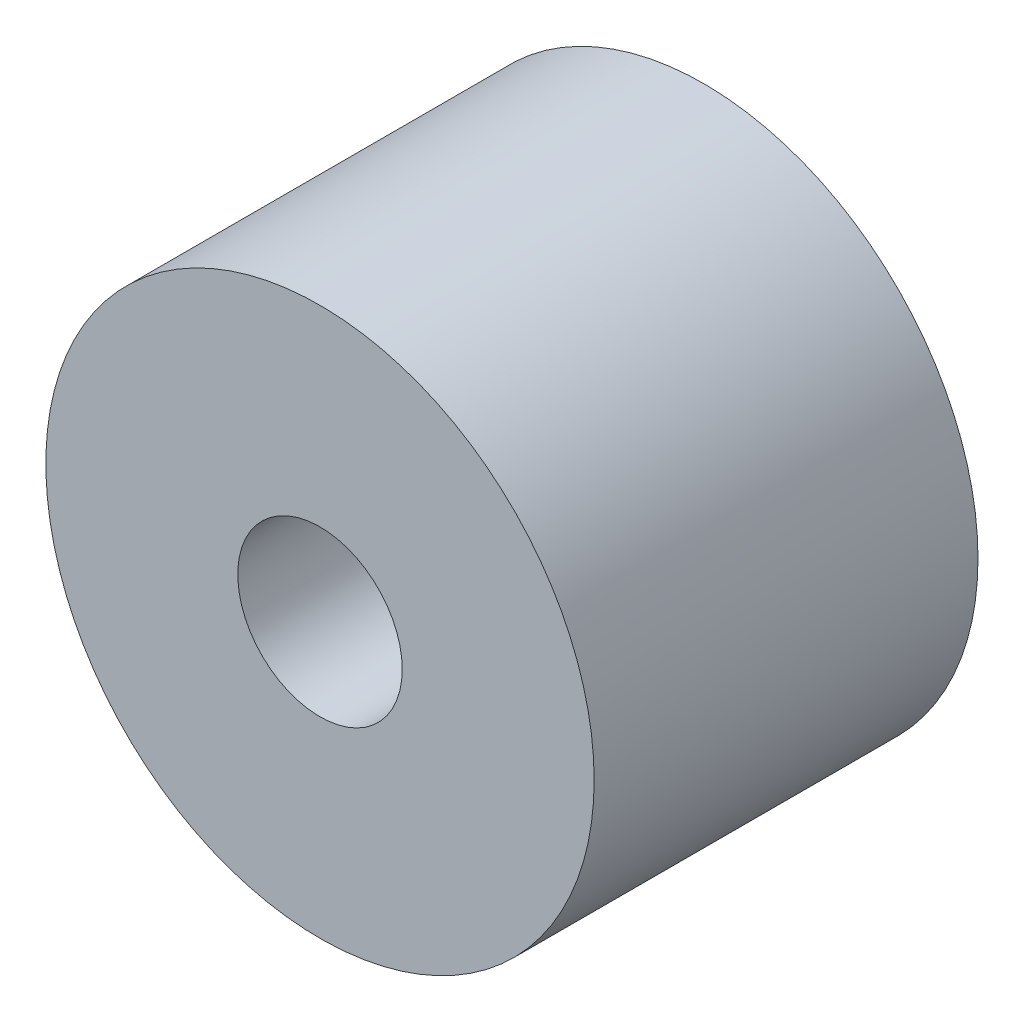
ISO-10303-21;
HEADER;
FILE_DESCRIPTION(('STEP AP214'),'2;1');
FILE_NAME('part.step','',(''),(''),'','','');
FILE_SCHEMA(('AUTOMOTIVE_DESIGN { 1 0 10303 214 1 1 1 1 }'));
ENDSEC;
DATA;
#1=APPLICATION_CONTEXT('core data for automotive mechanical design processes');
#2=APPLICATION_PROTOCOL_DEFINITION('international standard','automotive_design',2000,#1);
#3=PRODUCT_CONTEXT('',#1,'mechanical');
#4=PRODUCT('Part','Part','',(#3));
#5=PRODUCT_RELATED_PRODUCT_CATEGORY('part','',(#4));
#6=PRODUCT_DEFINITION_FORMATION('','',#4);
#7=PRODUCT_DEFINITION_CONTEXT('part definition',#1,'design');
#8=PRODUCT_DEFINITION('design','',#6,#7);
#9=PRODUCT_DEFINITION_SHAPE('','',#8);
#10=(LENGTH_UNIT() NAMED_UNIT(*) SI_UNIT(.MILLI.,.METRE.));
#11=(NAMED_UNIT(*) PLANE_ANGLE_UNIT() SI_UNIT($,.RADIAN.));
#12=(NAMED_UNIT(*) SI_UNIT($,.STERADIAN.) SOLID_ANGLE_UNIT());
#13=UNCERTAINTY_MEASURE_WITH_UNIT(LENGTH_MEASURE(1.E-05),#10,'distance_accuracy_value','');
#14=(GEOMETRIC_REPRESENTATION_CONTEXT(3) GLOBAL_UNCERTAINTY_ASSIGNED_CONTEXT((#13)) GLOBAL_UNIT_ASSIGNED_CONTEXT((#10,
#11,#12)) REPRESENTATION_CONTEXT('',''));
#15=CARTESIAN_POINT('',(0.,0.,0.));
#16=DIRECTION('',(0.,0.,1.));
#17=DIRECTION('',(1.,0.,0.));
#18=AXIS2_PLACEMENT_3D('',#15,#16,#17);
#19=CARTESIAN_POINT('',(0.,0.,3.5));
#20=DIRECTION('',(0.,0.,1.));
#21=DIRECTION('',(1.,0.,0.));
#22=AXIS2_PLACEMENT_3D('',#19,#20,#21);
#23=PLANE('',#22);
#24=CARTESIAN_POINT('',(0.,0.,3.5));
#25=DIRECTION('',(0.,0.,1.));
#26=DIRECTION('',(1.,0.,0.));
#27=AXIS2_PLACEMENT_3D('',#24,#25,#26);
#28=CIRCLE('',#27,5.);
#29=CARTESIAN_POINT('',(5.,0.,3.5));
#30=VERTEX_POINT('',#29);
#31=EDGE_CURVE('E10',#30,#30,#28,.T.);
#32=ORIENTED_EDGE('',*,*,#31,.T.);
#33=EDGE_LOOP('',(#32));
#34=FACE_BOUND('',#33,.T.);
#35=CARTESIAN_POINT('',(0.,0.,3.5));
#36=DIRECTION('',(0.,0.,1.));
#37=DIRECTION('',(1.,0.,0.));
#38=AXIS2_PLACEMENT_3D('',#35,#36,#37);
#39=CIRCLE('',#38,1.5);
#40=CARTESIAN_POINT('',(1.5,0.,3.5));
#41=VERTEX_POINT('',#40);
#42=EDGE_CURVE('E50',#41,#41,#39,.T.);
#43=ORIENTED_EDGE('',*,*,#42,.F.);
#44=EDGE_LOOP('',(#43));
#45=FACE_BOUND('',#44,.T.);
#46=ADVANCED_FACE('F37',(#34,#45),#23,.T.);
#47=CARTESIAN_POINT('',(0.,0.,-3.5));
#48=DIRECTION('',(0.,0.,1.));
#49=DIRECTION('',(1.,0.,0.));
#50=AXIS2_PLACEMENT_3D('',#47,#48,#49);
#51=PLANE('',#50);
#52=CARTESIAN_POINT('',(0.,0.,-3.5));
#53=DIRECTION('',(0.,0.,1.));
#54=DIRECTION('',(1.,0.,0.));
#55=AXIS2_PLACEMENT_3D('',#52,#53,#54);
#56=CIRCLE('',#55,5.);
#57=CARTESIAN_POINT('',(5.,0.,-3.5));
#58=VERTEX_POINT('',#57);
#59=EDGE_CURVE('E41',#58,#58,#56,.T.);
#60=ORIENTED_EDGE('',*,*,#59,.F.);
#61=EDGE_LOOP('',(#60));
#62=FACE_BOUND('',#61,.T.);
#63=CARTESIAN_POINT('',(0.,0.,-3.5));
#64=DIRECTION('',(0.,0.,1.));
#65=DIRECTION('',(1.,0.,0.));
#66=AXIS2_PLACEMENT_3D('',#63,#64,#65);
#67=CIRCLE('',#66,1.5);
#68=CARTESIAN_POINT('',(1.5,0.,-3.5));
#69=VERTEX_POINT('',#68);
#70=EDGE_CURVE('E52',#69,#69,#67,.T.);
#71=ORIENTED_EDGE('',*,*,#70,.T.);
#72=EDGE_LOOP('',(#71));
#73=FACE_BOUND('',#72,.T.);
#74=ADVANCED_FACE('F64',(#62,#73),#51,.F.);
#75=CARTESIAN_POINT('',(0.,0.,3.5));
#76=DIRECTION('',(0.,0.,-1.));
#77=DIRECTION('',(-1.,0.,0.));
#78=AXIS2_PLACEMENT_3D('',#75,#76,#77);
#79=CYLINDRICAL_SURFACE('',#78,5.);
#80=ORIENTED_EDGE('',*,*,#31,.F.);
#81=EDGE_LOOP('',(#80));
#82=FACE_BOUND('',#81,.T.);
#83=ORIENTED_EDGE('',*,*,#59,.T.);
#84=EDGE_LOOP('',(#83));
#85=FACE_BOUND('',#84,.T.);
#86=ADVANCED_FACE('F39',(#82,#85),#79,.T.);
#87=CARTESIAN_POINT('',(0.,0.,3.5));
#88=DIRECTION('',(0.,0.,-1.));
#89=DIRECTION('',(-1.,0.,0.));
#90=AXIS2_PLACEMENT_3D('',#87,#88,#89);
#91=CYLINDRICAL_SURFACE('',#90,1.5);
#92=ORIENTED_EDGE('',*,*,#42,.T.);
#93=EDGE_LOOP('',(#92));
#94=FACE_BOUND('',#93,.T.);
#95=ORIENTED_EDGE('',*,*,#70,.F.);
#96=EDGE_LOOP('',(#95));
#97=FACE_BOUND('',#96,.T.);
#98=ADVANCED_FACE('F60',(#94,#97),#91,.F.);
#99=CLOSED_SHELL('',(#46,#74,#86,#98));
#100=MANIFOLD_SOLID_BREP('B2',#99);
#101=ADVANCED_BREP_SHAPE_REPRESENTATION('',(#18,#100),#14);
#102=SHAPE_DEFINITION_REPRESENTATION(#9,#101);
ENDSEC;
END-ISO-10303-21;
